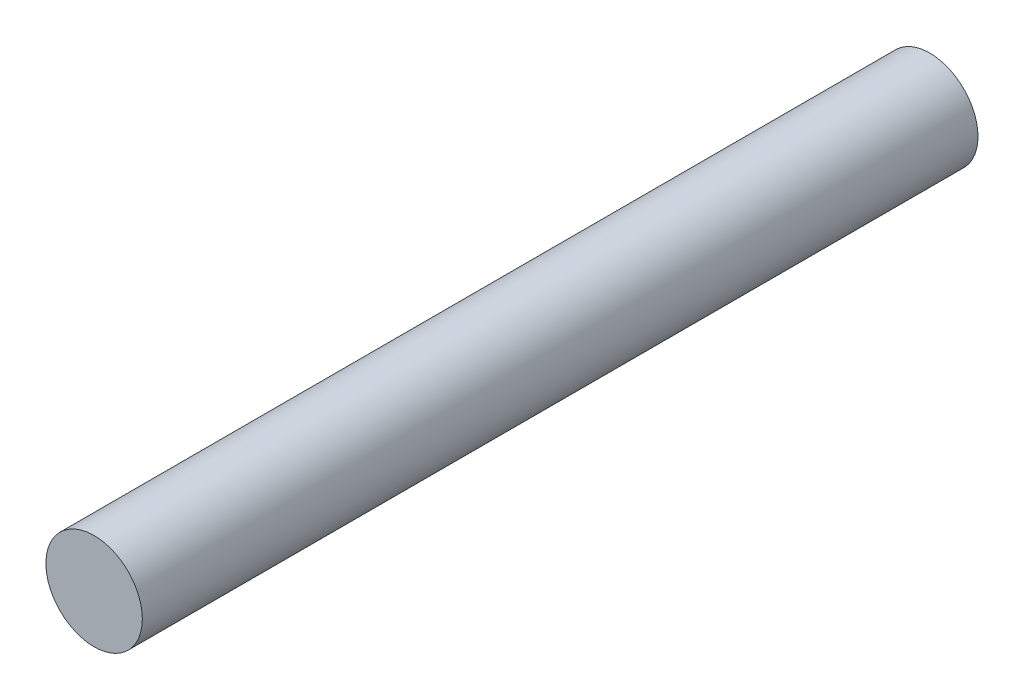
ISO-10303-21;
HEADER;
FILE_DESCRIPTION(('STEP AP214'),'2;1');
FILE_NAME('part.step','',(''),(''),'','','');
FILE_SCHEMA(('AUTOMOTIVE_DESIGN { 1 0 10303 214 1 1 1 1 }'));
ENDSEC;
DATA;
#1=APPLICATION_CONTEXT('core data for automotive mechanical design processes');
#2=APPLICATION_PROTOCOL_DEFINITION('international standard','automotive_design',2000,#1);
#3=PRODUCT_CONTEXT('',#1,'mechanical');
#4=PRODUCT('Part','Part','',(#3));
#5=PRODUCT_RELATED_PRODUCT_CATEGORY('part','',(#4));
#6=PRODUCT_DEFINITION_FORMATION('','',#4);
#7=PRODUCT_DEFINITION_CONTEXT('part definition',#1,'design');
#8=PRODUCT_DEFINITION('design','',#6,#7);
#9=PRODUCT_DEFINITION_SHAPE('','',#8);
#10=(LENGTH_UNIT() NAMED_UNIT(*) SI_UNIT(.MILLI.,.METRE.));
#11=(NAMED_UNIT(*) PLANE_ANGLE_UNIT() SI_UNIT($,.RADIAN.));
#12=(NAMED_UNIT(*) SI_UNIT($,.STERADIAN.) SOLID_ANGLE_UNIT());
#13=UNCERTAINTY_MEASURE_WITH_UNIT(LENGTH_MEASURE(1.E-05),#10,'distance_accuracy_value','');
#14=(GEOMETRIC_REPRESENTATION_CONTEXT(3) GLOBAL_UNCERTAINTY_ASSIGNED_CONTEXT((#13)) GLOBAL_UNIT_ASSIGNED_CONTEXT((#10,
#11,#12)) REPRESENTATION_CONTEXT('',''));
#15=CARTESIAN_POINT('',(0.,0.,0.));
#16=DIRECTION('',(0.,0.,1.));
#17=DIRECTION('',(1.,0.,0.));
#18=AXIS2_PLACEMENT_3D('',#15,#16,#17);
#19=CARTESIAN_POINT('',(0.,0.,130.));
#20=DIRECTION('',(0.,0.,-1.));
#21=DIRECTION('',(-1.,0.,0.));
#22=AXIS2_PLACEMENT_3D('',#19,#20,#21);
#23=CYLINDRICAL_SURFACE('',#22,7.5);
#24=CARTESIAN_POINT('',(0.,0.,130.));
#25=DIRECTION('',(0.,0.,1.));
#26=DIRECTION('',(1.,0.,0.));
#27=AXIS2_PLACEMENT_3D('',#24,#25,#26);
#28=CIRCLE('',#27,7.5);
#29=CARTESIAN_POINT('',(7.5,0.,130.));
#30=VERTEX_POINT('',#29);
#31=EDGE_CURVE('E10',#30,#30,#28,.T.);
#32=ORIENTED_EDGE('',*,*,#31,.F.);
#33=EDGE_LOOP('',(#32));
#34=FACE_BOUND('',#33,.T.);
#35=CARTESIAN_POINT('',(0.,0.,0.));
#36=DIRECTION('',(0.,0.,1.));
#37=DIRECTION('',(1.,0.,0.));
#38=AXIS2_PLACEMENT_3D('',#35,#36,#37);
#39=CIRCLE('',#38,7.5);
#40=CARTESIAN_POINT('',(7.5,0.,0.));
#41=VERTEX_POINT('',#40);
#42=EDGE_CURVE('E37',#41,#41,#39,.T.);
#43=ORIENTED_EDGE('',*,*,#42,.T.);
#44=EDGE_LOOP('',(#43));
#45=FACE_BOUND('',#44,.T.);
#46=ADVANCED_FACE('F34',(#34,#45),#23,.T.);
#47=CARTESIAN_POINT('',(0.,0.,130.));
#48=DIRECTION('',(0.,0.,1.));
#49=DIRECTION('',(1.,0.,0.));
#50=AXIS2_PLACEMENT_3D('',#47,#48,#49);
#51=PLANE('',#50);
#52=ORIENTED_EDGE('',*,*,#31,.T.);
#53=EDGE_LOOP('',(#52));
#54=FACE_BOUND('',#53,.T.);
#55=ADVANCED_FACE('F49',(#54),#51,.T.);
#56=CARTESIAN_POINT('',(0.,0.,0.));
#57=DIRECTION('',(0.,0.,1.));
#58=DIRECTION('',(1.,0.,0.));
#59=AXIS2_PLACEMENT_3D('',#56,#57,#58);
#60=PLANE('',#59);
#61=ORIENTED_EDGE('',*,*,#42,.F.);
#62=EDGE_LOOP('',(#61));
#63=FACE_BOUND('',#62,.T.);
#64=ADVANCED_FACE('F47',(#63),#60,.F.);
#65=CLOSED_SHELL('',(#46,#55,#64));
#66=MANIFOLD_SOLID_BREP('B2',#65);
#67=ADVANCED_BREP_SHAPE_REPRESENTATION('',(#18,#66),#14);
#68=SHAPE_DEFINITION_REPRESENTATION(#9,#67);
ENDSEC;
END-ISO-10303-21;
